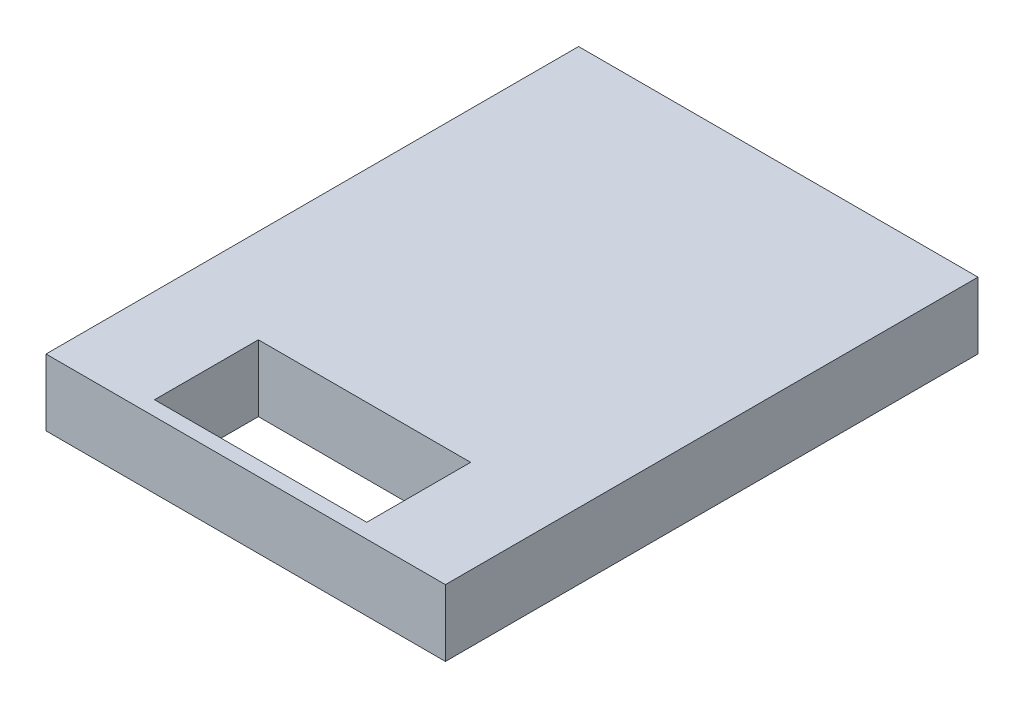
ISO-10303-21;
HEADER;
FILE_DESCRIPTION(('STEP AP214'),'2;1');
FILE_NAME('part.step','',(''),(''),'','','');
FILE_SCHEMA(('AUTOMOTIVE_DESIGN { 1 0 10303 214 1 1 1 1 }'));
ENDSEC;
DATA;
#1=APPLICATION_CONTEXT('core data for automotive mechanical design processes');
#2=APPLICATION_PROTOCOL_DEFINITION('international standard','automotive_design',2000,#1);
#3=PRODUCT_CONTEXT('',#1,'mechanical');
#4=PRODUCT('Part','Part','',(#3));
#5=PRODUCT_RELATED_PRODUCT_CATEGORY('part','',(#4));
#6=PRODUCT_DEFINITION_FORMATION('','',#4);
#7=PRODUCT_DEFINITION_CONTEXT('part definition',#1,'design');
#8=PRODUCT_DEFINITION('design','',#6,#7);
#9=PRODUCT_DEFINITION_SHAPE('','',#8);
#10=(LENGTH_UNIT() NAMED_UNIT(*) SI_UNIT(.MILLI.,.METRE.));
#11=(NAMED_UNIT(*) PLANE_ANGLE_UNIT() SI_UNIT($,.RADIAN.));
#12=(NAMED_UNIT(*) SI_UNIT($,.STERADIAN.) SOLID_ANGLE_UNIT());
#13=UNCERTAINTY_MEASURE_WITH_UNIT(LENGTH_MEASURE(1.E-05),#10,'distance_accuracy_value','');
#14=(GEOMETRIC_REPRESENTATION_CONTEXT(3) GLOBAL_UNCERTAINTY_ASSIGNED_CONTEXT((#13)) GLOBAL_UNIT_ASSIGNED_CONTEXT((#10,
#11,#12)) REPRESENTATION_CONTEXT('',''));
#15=CARTESIAN_POINT('',(0.,0.,0.));
#16=DIRECTION('',(0.,0.,1.));
#17=DIRECTION('',(1.,0.,0.));
#18=AXIS2_PLACEMENT_3D('',#15,#16,#17);
#19=CARTESIAN_POINT('',(0.,12.7,0.));
#20=DIRECTION('',(0.,-1.,0.));
#21=DIRECTION('',(0.,0.,-1.));
#22=AXIS2_PLACEMENT_3D('',#19,#20,#21);
#23=PLANE('',#22);
#24=DIRECTION('',(0.,0.,1.));
#25=VECTOR('',#24,1.);
#26=CARTESIAN_POINT('',(0.,12.7,0.));
#27=LINE('',#26,#25);
#28=CARTESIAN_POINT('',(0.,12.7,-101.6));
#29=VERTEX_POINT('',#28);
#30=CARTESIAN_POINT('',(0.,12.7,0.));
#31=VERTEX_POINT('',#30);
#32=EDGE_CURVE('E134',#29,#31,#27,.T.);
#33=ORIENTED_EDGE('',*,*,#32,.T.);
#34=DIRECTION('',(1.,0.,0.));
#35=VECTOR('',#34,1.);
#36=CARTESIAN_POINT('',(0.,12.7,0.));
#37=LINE('',#36,#35);
#38=CARTESIAN_POINT('',(76.2,12.7,0.));
#39=VERTEX_POINT('',#38);
#40=EDGE_CURVE('E137',#31,#39,#37,.T.);
#41=ORIENTED_EDGE('',*,*,#40,.T.);
#42=DIRECTION('',(0.,0.,-1.));
#43=VECTOR('',#42,1.);
#44=CARTESIAN_POINT('',(76.2,12.7,-101.6));
#45=LINE('',#44,#43);
#46=CARTESIAN_POINT('',(76.2,12.7,-101.6));
#47=VERTEX_POINT('',#46);
#48=EDGE_CURVE('E140',#39,#47,#45,.T.);
#49=ORIENTED_EDGE('',*,*,#48,.T.);
#50=DIRECTION('',(-1.,0.,0.));
#51=VECTOR('',#50,1.);
#52=CARTESIAN_POINT('',(0.,12.7,-101.6));
#53=LINE('',#52,#51);
#54=EDGE_CURVE('E142',#47,#29,#53,.T.);
#55=ORIENTED_EDGE('',*,*,#54,.T.);
#56=EDGE_LOOP('',(#33,#41,#49,#55));
#57=FACE_BOUND('',#56,.T.);
#58=DIRECTION('',(-1.,0.,0.));
#59=VECTOR('',#58,1.);
#60=CARTESIAN_POINT('',(17.907,12.7,-22.606));
#61=LINE('',#60,#59);
#62=CARTESIAN_POINT('',(58.398366427174,12.7,-22.606));
#63=VERTEX_POINT('',#62);
#64=CARTESIAN_POINT('',(17.907,12.7,-22.606));
#65=VERTEX_POINT('',#64);
#66=EDGE_CURVE('E98',#63,#65,#61,.T.);
#67=ORIENTED_EDGE('',*,*,#66,.F.);
#68=DIRECTION('',(0.,0.,-1.));
#69=VECTOR('',#68,1.);
#70=CARTESIAN_POINT('',(58.398366427174,12.7,-22.606));
#71=LINE('',#70,#69);
#72=CARTESIAN_POINT('',(58.3983664271741,12.7,-2.79400000000001));
#73=VERTEX_POINT('',#72);
#74=EDGE_CURVE('E120',#73,#63,#71,.T.);
#75=ORIENTED_EDGE('',*,*,#74,.F.);
#76=DIRECTION('',(1.,0.,0.));
#77=VECTOR('',#76,1.);
#78=CARTESIAN_POINT('',(58.3983664271741,12.7,-2.79400000000001));
#79=LINE('',#78,#77);
#80=CARTESIAN_POINT('',(17.907,12.7,-2.794));
#81=VERTEX_POINT('',#80);
#82=EDGE_CURVE('E118',#81,#73,#79,.T.);
#83=ORIENTED_EDGE('',*,*,#82,.F.);
#84=DIRECTION('',(0.,0.,1.));
#85=VECTOR('',#84,1.);
#86=CARTESIAN_POINT('',(17.907,12.7,-22.606));
#87=LINE('',#86,#85);
#88=EDGE_CURVE('E106',#65,#81,#87,.T.);
#89=ORIENTED_EDGE('',*,*,#88,.F.);
#90=EDGE_LOOP('',(#67,#75,#83,#89));
#91=FACE_BOUND('',#90,.T.);
#92=ADVANCED_FACE('F33',(#57,#91),#23,.F.);
#93=CARTESIAN_POINT('',(0.,0.,0.));
#94=DIRECTION('',(0.,-1.,0.));
#95=DIRECTION('',(0.,0.,-1.));
#96=AXIS2_PLACEMENT_3D('',#93,#94,#95);
#97=PLANE('',#96);
#98=DIRECTION('',(0.,0.,1.));
#99=VECTOR('',#98,1.);
#100=CARTESIAN_POINT('',(0.,0.,0.));
#101=LINE('',#100,#99);
#102=CARTESIAN_POINT('',(0.,0.,-101.6));
#103=VERTEX_POINT('',#102);
#104=CARTESIAN_POINT('',(0.,0.,0.));
#105=VERTEX_POINT('',#104);
#106=EDGE_CURVE('E114',#103,#105,#101,.T.);
#107=ORIENTED_EDGE('',*,*,#106,.F.);
#108=DIRECTION('',(-1.,0.,0.));
#109=VECTOR('',#108,1.);
#110=CARTESIAN_POINT('',(0.,0.,-101.6));
#111=LINE('',#110,#109);
#112=CARTESIAN_POINT('',(76.2,0.,-101.6));
#113=VERTEX_POINT('',#112);
#114=EDGE_CURVE('E138',#113,#103,#111,.T.);
#115=ORIENTED_EDGE('',*,*,#114,.F.);
#116=DIRECTION('',(0.,0.,-1.));
#117=VECTOR('',#116,1.);
#118=CARTESIAN_POINT('',(76.2,0.,-101.6));
#119=LINE('',#118,#117);
#120=CARTESIAN_POINT('',(76.2,0.,0.));
#121=VERTEX_POINT('',#120);
#122=EDGE_CURVE('E149',#121,#113,#119,.T.);
#123=ORIENTED_EDGE('',*,*,#122,.F.);
#124=DIRECTION('',(1.,0.,0.));
#125=VECTOR('',#124,1.);
#126=CARTESIAN_POINT('',(0.,0.,0.));
#127=LINE('',#126,#125);
#128=EDGE_CURVE('E147',#105,#121,#127,.T.);
#129=ORIENTED_EDGE('',*,*,#128,.F.);
#130=EDGE_LOOP('',(#107,#115,#123,#129));
#131=FACE_BOUND('',#130,.T.);
#132=DIRECTION('',(0.,0.,-1.));
#133=VECTOR('',#132,1.);
#134=CARTESIAN_POINT('',(58.398366427174,0.,-22.606));
#135=LINE('',#134,#133);
#136=CARTESIAN_POINT('',(58.3983664271741,0.,-2.79400000000001));
#137=VERTEX_POINT('',#136);
#138=CARTESIAN_POINT('',(58.398366427174,0.,-22.606));
#139=VERTEX_POINT('',#138);
#140=EDGE_CURVE('E107',#137,#139,#135,.T.);
#141=ORIENTED_EDGE('',*,*,#140,.T.);
#142=DIRECTION('',(-1.,0.,0.));
#143=VECTOR('',#142,1.);
#144=CARTESIAN_POINT('',(17.907,0.,-22.606));
#145=LINE('',#144,#143);
#146=CARTESIAN_POINT('',(17.907,0.,-22.606));
#147=VERTEX_POINT('',#146);
#148=EDGE_CURVE('E56',#139,#147,#145,.T.);
#149=ORIENTED_EDGE('',*,*,#148,.T.);
#150=DIRECTION('',(0.,0.,1.));
#151=VECTOR('',#150,1.);
#152=CARTESIAN_POINT('',(17.907,0.,-22.606));
#153=LINE('',#152,#151);
#154=CARTESIAN_POINT('',(17.907,0.,-2.794));
#155=VERTEX_POINT('',#154);
#156=EDGE_CURVE('E113',#147,#155,#153,.T.);
#157=ORIENTED_EDGE('',*,*,#156,.T.);
#158=DIRECTION('',(1.,0.,0.));
#159=VECTOR('',#158,1.);
#160=CARTESIAN_POINT('',(58.3983664271741,0.,-2.79400000000001));
#161=LINE('',#160,#159);
#162=EDGE_CURVE('E126',#155,#137,#161,.T.);
#163=ORIENTED_EDGE('',*,*,#162,.T.);
#164=EDGE_LOOP('',(#141,#149,#157,#163));
#165=FACE_BOUND('',#164,.T.);
#166=ADVANCED_FACE('F167',(#131,#165),#97,.T.);
#167=CARTESIAN_POINT('',(0.,12.7,0.));
#168=DIRECTION('',(1.,0.,0.));
#169=DIRECTION('',(0.,0.,-1.));
#170=AXIS2_PLACEMENT_3D('',#167,#168,#169);
#171=PLANE('',#170);
#172=ORIENTED_EDGE('',*,*,#106,.T.);
#173=DIRECTION('',(0.,-1.,0.));
#174=VECTOR('',#173,1.);
#175=CARTESIAN_POINT('',(0.,12.7,0.));
#176=LINE('',#175,#174);
#177=EDGE_CURVE('E11',#31,#105,#176,.T.);
#178=ORIENTED_EDGE('',*,*,#177,.F.);
#179=ORIENTED_EDGE('',*,*,#32,.F.);
#180=DIRECTION('',(0.,-1.,0.));
#181=VECTOR('',#180,1.);
#182=CARTESIAN_POINT('',(0.,12.7,-101.6));
#183=LINE('',#182,#181);
#184=EDGE_CURVE('E144',#29,#103,#183,.T.);
#185=ORIENTED_EDGE('',*,*,#184,.T.);
#186=EDGE_LOOP('',(#172,#178,#179,#185));
#187=FACE_BOUND('',#186,.T.);
#188=ADVANCED_FACE('F35',(#187),#171,.F.);
#189=CARTESIAN_POINT('',(0.,12.7,0.));
#190=DIRECTION('',(0.,0.,-1.));
#191=DIRECTION('',(-1.,0.,0.));
#192=AXIS2_PLACEMENT_3D('',#189,#190,#191);
#193=PLANE('',#192);
#194=ORIENTED_EDGE('',*,*,#128,.T.);
#195=DIRECTION('',(0.,-1.,0.));
#196=VECTOR('',#195,1.);
#197=CARTESIAN_POINT('',(76.2,12.7,0.));
#198=LINE('',#197,#196);
#199=EDGE_CURVE('E41',#39,#121,#198,.T.);
#200=ORIENTED_EDGE('',*,*,#199,.F.);
#201=ORIENTED_EDGE('',*,*,#40,.F.);
#202=ORIENTED_EDGE('',*,*,#177,.T.);
#203=EDGE_LOOP('',(#194,#200,#201,#202));
#204=FACE_BOUND('',#203,.T.);
#205=ADVANCED_FACE('F177',(#204),#193,.F.);
#206=CARTESIAN_POINT('',(76.2,12.7,-101.6));
#207=DIRECTION('',(-1.,0.,0.));
#208=DIRECTION('',(0.,0.,1.));
#209=AXIS2_PLACEMENT_3D('',#206,#207,#208);
#210=PLANE('',#209);
#211=ORIENTED_EDGE('',*,*,#122,.T.);
#212=DIRECTION('',(0.,-1.,0.));
#213=VECTOR('',#212,1.);
#214=CARTESIAN_POINT('',(76.2,12.7,-101.6));
#215=LINE('',#214,#213);
#216=EDGE_CURVE('E154',#47,#113,#215,.T.);
#217=ORIENTED_EDGE('',*,*,#216,.F.);
#218=ORIENTED_EDGE('',*,*,#48,.F.);
#219=ORIENTED_EDGE('',*,*,#199,.T.);
#220=EDGE_LOOP('',(#211,#217,#218,#219));
#221=FACE_BOUND('',#220,.T.);
#222=ADVANCED_FACE('F161',(#221),#210,.F.);
#223=CARTESIAN_POINT('',(0.,12.7,-101.6));
#224=DIRECTION('',(0.,0.,1.));
#225=DIRECTION('',(1.,0.,0.));
#226=AXIS2_PLACEMENT_3D('',#223,#224,#225);
#227=PLANE('',#226);
#228=ORIENTED_EDGE('',*,*,#114,.T.);
#229=ORIENTED_EDGE('',*,*,#184,.F.);
#230=ORIENTED_EDGE('',*,*,#54,.F.);
#231=ORIENTED_EDGE('',*,*,#216,.T.);
#232=EDGE_LOOP('',(#228,#229,#230,#231));
#233=FACE_BOUND('',#232,.T.);
#234=ADVANCED_FACE('F171',(#233),#227,.F.);
#235=CARTESIAN_POINT('',(17.907,12.7,-22.606));
#236=DIRECTION('',(0.,0.,1.));
#237=DIRECTION('',(1.,0.,0.));
#238=AXIS2_PLACEMENT_3D('',#235,#236,#237);
#239=PLANE('',#238);
#240=ORIENTED_EDGE('',*,*,#148,.F.);
#241=DIRECTION('',(0.,-1.,0.));
#242=VECTOR('',#241,1.);
#243=CARTESIAN_POINT('',(58.398366427174,12.7,-22.606));
#244=LINE('',#243,#242);
#245=EDGE_CURVE('E102',#63,#139,#244,.T.);
#246=ORIENTED_EDGE('',*,*,#245,.F.);
#247=ORIENTED_EDGE('',*,*,#66,.T.);
#248=DIRECTION('',(0.,-1.,0.));
#249=VECTOR('',#248,1.);
#250=CARTESIAN_POINT('',(17.907,12.7,-22.606));
#251=LINE('',#250,#249);
#252=EDGE_CURVE('E101',#65,#147,#251,.T.);
#253=ORIENTED_EDGE('',*,*,#252,.T.);
#254=EDGE_LOOP('',(#240,#246,#247,#253));
#255=FACE_BOUND('',#254,.T.);
#256=ADVANCED_FACE('F100',(#255),#239,.T.);
#257=CARTESIAN_POINT('',(17.907,12.7,-22.606));
#258=DIRECTION('',(1.,0.,0.));
#259=DIRECTION('',(0.,0.,-1.));
#260=AXIS2_PLACEMENT_3D('',#257,#258,#259);
#261=PLANE('',#260);
#262=ORIENTED_EDGE('',*,*,#156,.F.);
#263=ORIENTED_EDGE('',*,*,#252,.F.);
#264=ORIENTED_EDGE('',*,*,#88,.T.);
#265=DIRECTION('',(0.,-1.,0.));
#266=VECTOR('',#265,1.);
#267=CARTESIAN_POINT('',(17.907,12.7,-2.794));
#268=LINE('',#267,#266);
#269=EDGE_CURVE('E115',#81,#155,#268,.T.);
#270=ORIENTED_EDGE('',*,*,#269,.T.);
#271=EDGE_LOOP('',(#262,#263,#264,#270));
#272=FACE_BOUND('',#271,.T.);
#273=ADVANCED_FACE('F110',(#272),#261,.T.);
#274=CARTESIAN_POINT('',(58.3983664271741,12.7,-2.79400000000001));
#275=DIRECTION('',(0.,0.,-1.));
#276=DIRECTION('',(-1.,0.,0.));
#277=AXIS2_PLACEMENT_3D('',#274,#275,#276);
#278=PLANE('',#277);
#279=ORIENTED_EDGE('',*,*,#162,.F.);
#280=ORIENTED_EDGE('',*,*,#269,.F.);
#281=ORIENTED_EDGE('',*,*,#82,.T.);
#282=DIRECTION('',(0.,-1.,0.));
#283=VECTOR('',#282,1.);
#284=CARTESIAN_POINT('',(58.3983664271741,12.7,-2.79400000000001));
#285=LINE('',#284,#283);
#286=EDGE_CURVE('E48',#73,#137,#285,.T.);
#287=ORIENTED_EDGE('',*,*,#286,.T.);
#288=EDGE_LOOP('',(#279,#280,#281,#287));
#289=FACE_BOUND('',#288,.T.);
#290=ADVANCED_FACE('F200',(#289),#278,.T.);
#291=CARTESIAN_POINT('',(58.398366427174,12.7,-22.606));
#292=DIRECTION('',(-1.,0.,0.));
#293=DIRECTION('',(0.,0.,1.));
#294=AXIS2_PLACEMENT_3D('',#291,#292,#293);
#295=PLANE('',#294);
#296=ORIENTED_EDGE('',*,*,#140,.F.);
#297=ORIENTED_EDGE('',*,*,#286,.F.);
#298=ORIENTED_EDGE('',*,*,#74,.T.);
#299=ORIENTED_EDGE('',*,*,#245,.T.);
#300=EDGE_LOOP('',(#296,#297,#298,#299));
#301=FACE_BOUND('',#300,.T.);
#302=ADVANCED_FACE('F204',(#301),#295,.T.);
#303=CLOSED_SHELL('',(#92,#166,#188,#205,#222,#234,#256,#273,#290,#302));
#304=MANIFOLD_SOLID_BREP('B2',#303);
#305=ADVANCED_BREP_SHAPE_REPRESENTATION('',(#18,#304),#14);
#306=SHAPE_DEFINITION_REPRESENTATION(#9,#305);
ENDSEC;
END-ISO-10303-21;
